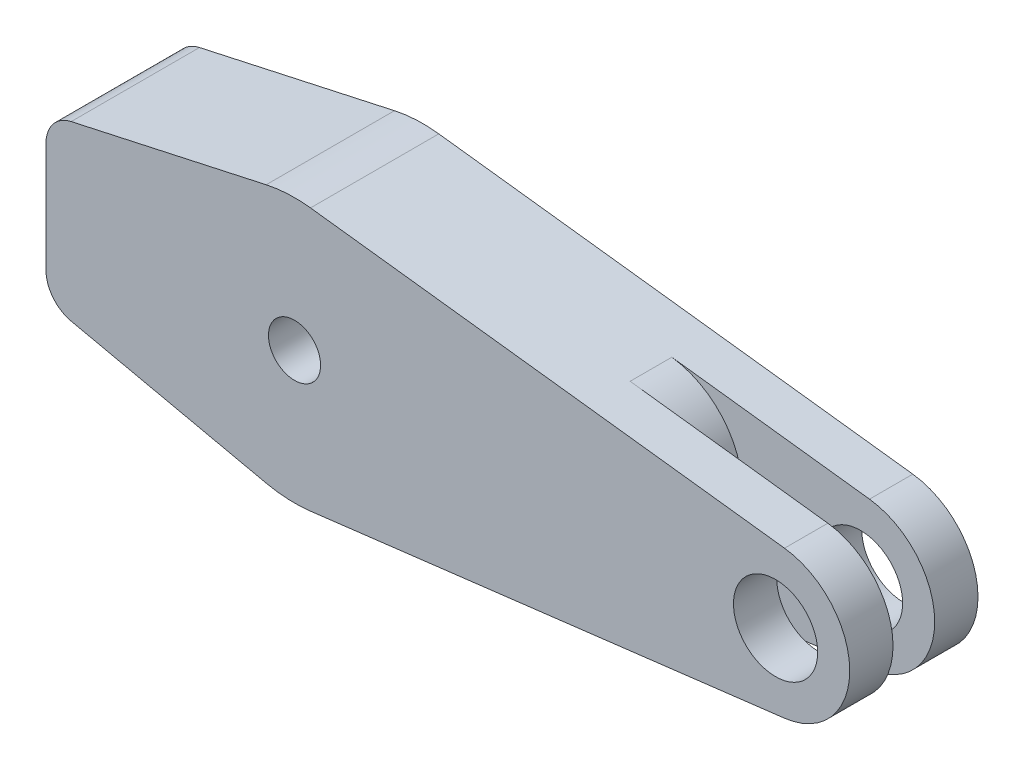
ISO-10303-21;
HEADER;
FILE_DESCRIPTION(('STEP AP214'),'2;1');
FILE_NAME('part.step','',(''),(''),'','','');
FILE_SCHEMA(('AUTOMOTIVE_DESIGN { 1 0 10303 214 1 1 1 1 }'));
ENDSEC;
DATA;
#1=APPLICATION_CONTEXT('core data for automotive mechanical design processes');
#2=APPLICATION_PROTOCOL_DEFINITION('international standard','automotive_design',2000,#1);
#3=PRODUCT_CONTEXT('',#1,'mechanical');
#4=PRODUCT('Part','Part','',(#3));
#5=PRODUCT_RELATED_PRODUCT_CATEGORY('part','',(#4));
#6=PRODUCT_DEFINITION_FORMATION('','',#4);
#7=PRODUCT_DEFINITION_CONTEXT('part definition',#1,'design');
#8=PRODUCT_DEFINITION('design','',#6,#7);
#9=PRODUCT_DEFINITION_SHAPE('','',#8);
#10=(LENGTH_UNIT() NAMED_UNIT(*) SI_UNIT(.MILLI.,.METRE.));
#11=(NAMED_UNIT(*) PLANE_ANGLE_UNIT() SI_UNIT($,.RADIAN.));
#12=(NAMED_UNIT(*) SI_UNIT($,.STERADIAN.) SOLID_ANGLE_UNIT());
#13=UNCERTAINTY_MEASURE_WITH_UNIT(LENGTH_MEASURE(1.E-05),#10,'distance_accuracy_value','');
#14=(GEOMETRIC_REPRESENTATION_CONTEXT(3) GLOBAL_UNCERTAINTY_ASSIGNED_CONTEXT((#13)) GLOBAL_UNIT_ASSIGNED_CONTEXT((#10,
#11,#12)) REPRESENTATION_CONTEXT('',''));
#15=CARTESIAN_POINT('',(0.,0.,0.));
#16=DIRECTION('',(0.,0.,1.));
#17=DIRECTION('',(1.,0.,0.));
#18=AXIS2_PLACEMENT_3D('',#15,#16,#17);
#19=CARTESIAN_POINT('',(-1.76785714285714,-8.05836094515808,8.));
#20=DIRECTION('',(-0.214285714285714,-0.976771023655525,0.));
#21=DIRECTION('',(0.976771023655525,-0.214285714285714,0.));
#22=AXIS2_PLACEMENT_3D('',#19,#20,#21);
#23=PLANE('',#22);
#24=DIRECTION('',(-0.976771023655525,0.214285714285714,0.));
#25=VECTOR('',#24,1.);
#26=CARTESIAN_POINT('',(-1.76785714285714,-8.05836094515808,8.));
#27=LINE('',#26,#25);
#28=CARTESIAN_POINT('',(-1.76785714285714,-8.05836094515808,8.));
#29=VERTEX_POINT('',#28);
#30=CARTESIAN_POINT('',(-13.9285714285714,-5.39052244070856,8.));
#31=VERTEX_POINT('',#30);
#32=EDGE_CURVE('E293',#29,#31,#27,.T.);
#33=ORIENTED_EDGE('',*,*,#32,.T.);
#34=DIRECTION('',(0.,0.,-1.));
#35=VECTOR('',#34,1.);
#36=CARTESIAN_POINT('',(-13.9285714285714,-5.39052244070856,8.));
#37=LINE('',#36,#35);
#38=CARTESIAN_POINT('',(-13.9285714285714,-5.39052244070856,0.));
#39=VERTEX_POINT('',#38);
#40=EDGE_CURVE('E12',#31,#39,#37,.T.);
#41=ORIENTED_EDGE('',*,*,#40,.T.);
#42=DIRECTION('',(-0.976771023655525,0.214285714285714,0.));
#43=VECTOR('',#42,1.);
#44=CARTESIAN_POINT('',(-1.76785714285714,-8.05836094515808,0.));
#45=LINE('',#44,#43);
#46=CARTESIAN_POINT('',(-1.76785714285714,-8.05836094515808,0.));
#47=VERTEX_POINT('',#46);
#48=EDGE_CURVE('E322',#47,#39,#45,.T.);
#49=ORIENTED_EDGE('',*,*,#48,.F.);
#50=DIRECTION('',(0.,0.,-1.));
#51=VECTOR('',#50,1.);
#52=CARTESIAN_POINT('',(-1.76785714285714,-8.05836094515808,8.));
#53=LINE('',#52,#51);
#54=EDGE_CURVE('E367',#29,#47,#53,.T.);
#55=ORIENTED_EDGE('',*,*,#54,.F.);
#56=EDGE_LOOP('',(#33,#41,#49,#55));
#57=FACE_BOUND('',#56,.T.);
#58=ADVANCED_FACE('F72',(#57),#23,.T.);
#59=CARTESIAN_POINT('',(-1.76785714285714,8.05836094515808,8.));
#60=DIRECTION('',(-0.214285714285714,0.976771023655525,0.));
#61=DIRECTION('',(-0.976771023655525,-0.214285714285714,0.));
#62=AXIS2_PLACEMENT_3D('',#59,#60,#61);
#63=PLANE('',#62);
#64=DIRECTION('',(0.976771023655525,0.214285714285714,0.));
#65=VECTOR('',#64,1.);
#66=CARTESIAN_POINT('',(-1.76785714285714,8.05836094515808,0.));
#67=LINE('',#66,#65);
#68=CARTESIAN_POINT('',(-13.9285714285714,5.39052244070856,0.));
#69=VERTEX_POINT('',#68);
#70=CARTESIAN_POINT('',(-1.76785714285714,8.05836094515808,0.));
#71=VERTEX_POINT('',#70);
#72=EDGE_CURVE('E289',#69,#71,#67,.T.);
#73=ORIENTED_EDGE('',*,*,#72,.F.);
#74=DIRECTION('',(0.,0.,1.));
#75=VECTOR('',#74,1.);
#76=CARTESIAN_POINT('',(-13.9285714285714,5.39052244070856,8.));
#77=LINE('',#76,#75);
#78=CARTESIAN_POINT('',(-13.9285714285714,5.39052244070856,8.));
#79=VERTEX_POINT('',#78);
#80=EDGE_CURVE('E413',#69,#79,#77,.T.);
#81=ORIENTED_EDGE('',*,*,#80,.T.);
#82=DIRECTION('',(0.976771023655525,0.214285714285714,0.));
#83=VECTOR('',#82,1.);
#84=CARTESIAN_POINT('',(-1.76785714285714,8.05836094515808,8.));
#85=LINE('',#84,#83);
#86=CARTESIAN_POINT('',(-1.76785714285714,8.05836094515808,8.));
#87=VERTEX_POINT('',#86);
#88=EDGE_CURVE('E290',#79,#87,#85,.T.);
#89=ORIENTED_EDGE('',*,*,#88,.T.);
#90=DIRECTION('',(0.,0.,-1.));
#91=VECTOR('',#90,1.);
#92=CARTESIAN_POINT('',(-1.76785714285714,8.05836094515808,8.));
#93=LINE('',#92,#91);
#94=EDGE_CURVE('E319',#87,#71,#93,.T.);
#95=ORIENTED_EDGE('',*,*,#94,.T.);
#96=EDGE_LOOP('',(#73,#81,#89,#95));
#97=FACE_BOUND('',#96,.T.);
#98=ADVANCED_FACE('F439',(#97),#63,.T.);
#99=CARTESIAN_POINT('',(0.,0.,0.));
#100=DIRECTION('',(0.,0.,1.));
#101=DIRECTION('',(1.,0.,0.));
#102=AXIS2_PLACEMENT_3D('',#99,#100,#101);
#103=PLANE('',#102);
#104=CARTESIAN_POINT('',(30.,0.,0.));
#105=DIRECTION('',(0.,0.,1.));
#106=DIRECTION('',(1.,0.,0.));
#107=AXIS2_PLACEMENT_3D('',#104,#105,#106);
#108=CIRCLE('',#107,2.625);
#109=CARTESIAN_POINT('',(32.625,0.,0.));
#110=VERTEX_POINT('',#109);
#111=EDGE_CURVE('E294',#110,#110,#108,.T.);
#112=ORIENTED_EDGE('',*,*,#111,.T.);
#113=EDGE_LOOP('',(#112));
#114=FACE_BOUND('',#113,.T.);
#115=DIRECTION('',(0.,1.,0.));
#116=VECTOR('',#115,1.);
#117=CARTESIAN_POINT('',(-15.5,11.5023210939197,0.));
#118=LINE('',#117,#116);
#119=CARTESIAN_POINT('',(-15.5,2.99821693892124,0.));
#120=VERTEX_POINT('',#119);
#121=CARTESIAN_POINT('',(-15.5,3.43698039339752,0.));
#122=VERTEX_POINT('',#121);
#123=EDGE_CURVE('E241',#120,#122,#118,.T.);
#124=ORIENTED_EDGE('',*,*,#123,.T.);
#125=CARTESIAN_POINT('',(-13.5,3.43698039339751,0.));
#126=DIRECTION('',(0.,0.,1.));
#127=DIRECTION('',(1.,0.,0.));
#128=AXIS2_PLACEMENT_3D('',#125,#126,#127);
#129=CIRCLE('',#128,2.);
#130=EDGE_CURVE('E81',#122,#69,#129,.F.);
#131=ORIENTED_EDGE('',*,*,#130,.T.);
#132=ORIENTED_EDGE('',*,*,#72,.T.);
#133=CARTESIAN_POINT('',(0.,0.,0.));
#134=DIRECTION('',(0.,0.,1.));
#135=DIRECTION('',(1.,0.,0.));
#136=AXIS2_PLACEMENT_3D('',#133,#134,#135);
#137=CIRCLE('',#136,8.25);
#138=CARTESIAN_POINT('',(0.996875,8.18955067353363,0.));
#139=VERTEX_POINT('',#138);
#140=EDGE_CURVE('E340',#139,#71,#137,.T.);
#141=ORIENTED_EDGE('',*,*,#140,.F.);
#142=DIRECTION('',(0.992672808913166,-0.120833333333333,0.));
#143=VECTOR('',#142,1.);
#144=CARTESIAN_POINT('',(0.996875,8.18955067353363,0.));
#145=LINE('',#144,#143);
#146=CARTESIAN_POINT('',(30.5588541666667,4.5911117412234,0.));
#147=VERTEX_POINT('',#146);
#148=EDGE_CURVE('E336',#139,#147,#145,.T.);
#149=ORIENTED_EDGE('',*,*,#148,.T.);
#150=CARTESIAN_POINT('',(30.,0.,0.));
#151=DIRECTION('',(0.,0.,1.));
#152=DIRECTION('',(1.,0.,0.));
#153=AXIS2_PLACEMENT_3D('',#150,#151,#152);
#154=CIRCLE('',#153,4.62500000000001);
#155=CARTESIAN_POINT('',(30.5588541666667,-4.5911117412234,0.));
#156=VERTEX_POINT('',#155);
#157=EDGE_CURVE('E332',#156,#147,#154,.T.);
#158=ORIENTED_EDGE('',*,*,#157,.F.);
#159=DIRECTION('',(0.992672808913166,0.120833333333333,0.));
#160=VECTOR('',#159,1.);
#161=CARTESIAN_POINT('',(0.996875,-8.18955067353363,0.));
#162=LINE('',#161,#160);
#163=CARTESIAN_POINT('',(0.996875,-8.18955067353363,0.));
#164=VERTEX_POINT('',#163);
#165=EDGE_CURVE('E328',#164,#156,#162,.T.);
#166=ORIENTED_EDGE('',*,*,#165,.F.);
#167=CARTESIAN_POINT('',(0.,0.,0.));
#168=DIRECTION('',(0.,0.,1.));
#169=DIRECTION('',(1.,0.,0.));
#170=AXIS2_PLACEMENT_3D('',#167,#168,#169);
#171=CIRCLE('',#170,8.25);
#172=EDGE_CURVE('E325',#47,#164,#171,.T.);
#173=ORIENTED_EDGE('',*,*,#172,.F.);
#174=ORIENTED_EDGE('',*,*,#48,.T.);
#175=CARTESIAN_POINT('',(-13.5,-3.43698039339752,0.));
#176=DIRECTION('',(0.,0.,1.));
#177=DIRECTION('',(1.,0.,0.));
#178=AXIS2_PLACEMENT_3D('',#175,#176,#177);
#179=CIRCLE('',#178,2.);
#180=CARTESIAN_POINT('',(-15.5,-3.43698039339751,0.));
#181=VERTEX_POINT('',#180);
#182=EDGE_CURVE('E88',#39,#181,#179,.F.);
#183=ORIENTED_EDGE('',*,*,#182,.T.);
#184=CARTESIAN_POINT('',(-15.5,-2.99821693892123,0.));
#185=VERTEX_POINT('',#184);
#186=EDGE_CURVE('E231',#181,#185,#118,.T.);
#187=ORIENTED_EDGE('',*,*,#186,.T.);
#188=DIRECTION('',(-0.976771023655525,0.214285714285714,0.));
#189=VECTOR('',#188,1.);
#190=CARTESIAN_POINT('',(-1.33928571428571,-6.10481889784703,0.));
#191=LINE('',#190,#189);
#192=CARTESIAN_POINT('',(-1.33928571428571,-6.10481889784703,0.));
#193=VERTEX_POINT('',#192);
#194=EDGE_CURVE('E237',#193,#185,#191,.T.);
#195=ORIENTED_EDGE('',*,*,#194,.F.);
#196=CARTESIAN_POINT('',(0.,0.,0.));
#197=DIRECTION('',(0.,0.,1.));
#198=DIRECTION('',(1.,0.,0.));
#199=AXIS2_PLACEMENT_3D('',#196,#197,#198);
#200=CIRCLE('',#199,6.25);
#201=CARTESIAN_POINT('',(1.33928571428571,-6.10481889784703,0.));
#202=VERTEX_POINT('',#201);
#203=EDGE_CURVE('E259',#193,#202,#200,.T.);
#204=ORIENTED_EDGE('',*,*,#203,.T.);
#205=DIRECTION('',(0.976771023655525,0.214285714285714,0.));
#206=VECTOR('',#205,1.);
#207=CARTESIAN_POINT('',(1.33928571428571,-6.10481889784703,0.));
#208=LINE('',#207,#206);
#209=CARTESIAN_POINT('',(18.0357142857143,-2.44192755913881,0.));
#210=VERTEX_POINT('',#209);
#211=EDGE_CURVE('E486',#202,#210,#208,.T.);
#212=ORIENTED_EDGE('',*,*,#211,.T.);
#213=CARTESIAN_POINT('',(17.5,0.,0.));
#214=DIRECTION('',(0.,0.,1.));
#215=DIRECTION('',(1.,0.,0.));
#216=AXIS2_PLACEMENT_3D('',#213,#214,#215);
#217=CIRCLE('',#216,2.5);
#218=CARTESIAN_POINT('',(18.0357142857143,2.44192755913881,0.));
#219=VERTEX_POINT('',#218);
#220=EDGE_CURVE('E510',#219,#210,#217,.F.);
#221=ORIENTED_EDGE('',*,*,#220,.F.);
#222=DIRECTION('',(0.976771023655525,-0.214285714285714,0.));
#223=VECTOR('',#222,1.);
#224=CARTESIAN_POINT('',(1.33928571428571,6.10481889784703,0.));
#225=LINE('',#224,#223);
#226=CARTESIAN_POINT('',(1.33928571428571,6.10481889784703,0.));
#227=VERTEX_POINT('',#226);
#228=EDGE_CURVE('E514',#227,#219,#225,.T.);
#229=ORIENTED_EDGE('',*,*,#228,.F.);
#230=CARTESIAN_POINT('',(-1.33928571428571,6.10481889784703,0.));
#231=VERTEX_POINT('',#230);
#232=EDGE_CURVE('E266',#227,#231,#200,.T.);
#233=ORIENTED_EDGE('',*,*,#232,.T.);
#234=DIRECTION('',(0.976771023655525,0.214285714285714,0.));
#235=VECTOR('',#234,1.);
#236=CARTESIAN_POINT('',(-1.33928571428571,6.10481889784703,0.));
#237=LINE('',#236,#235);
#238=EDGE_CURVE('E260',#120,#231,#237,.T.);
#239=ORIENTED_EDGE('',*,*,#238,.F.);
#240=EDGE_LOOP('',(#124,#131,#132,#141,#149,#158,#166,#173,#174,#183,#187,#195,#204,#212,#221,
#229,#233,#239));
#241=FACE_BOUND('',#240,.T.);
#242=ADVANCED_FACE('F234',(#114,#241),#103,.F.);
#243=CARTESIAN_POINT('',(0.,0.,8.));
#244=DIRECTION('',(0.,0.,1.));
#245=DIRECTION('',(1.,0.,0.));
#246=AXIS2_PLACEMENT_3D('',#243,#244,#245);
#247=PLANE('',#246);
#248=CARTESIAN_POINT('',(0.,0.,8.));
#249=DIRECTION('',(0.,0.,1.));
#250=DIRECTION('',(1.,0.,0.));
#251=AXIS2_PLACEMENT_3D('',#248,#249,#250);
#252=CIRCLE('',#251,1.625);
#253=CARTESIAN_POINT('',(1.625,0.,8.));
#254=VERTEX_POINT('',#253);
#255=EDGE_CURVE('E410',#254,#254,#252,.T.);
#256=ORIENTED_EDGE('',*,*,#255,.F.);
#257=EDGE_LOOP('',(#256));
#258=FACE_BOUND('',#257,.T.);
#259=CARTESIAN_POINT('',(30.,0.,8.));
#260=DIRECTION('',(0.,0.,1.));
#261=DIRECTION('',(1.,0.,0.));
#262=AXIS2_PLACEMENT_3D('',#259,#260,#261);
#263=CIRCLE('',#262,2.625);
#264=CARTESIAN_POINT('',(32.625,0.,8.));
#265=VERTEX_POINT('',#264);
#266=EDGE_CURVE('E315',#265,#265,#263,.T.);
#267=ORIENTED_EDGE('',*,*,#266,.F.);
#268=EDGE_LOOP('',(#267));
#269=FACE_BOUND('',#268,.T.);
#270=ORIENTED_EDGE('',*,*,#88,.F.);
#271=CARTESIAN_POINT('',(-13.5,3.43698039339751,8.));
#272=DIRECTION('',(0.,0.,1.));
#273=DIRECTION('',(1.,0.,0.));
#274=AXIS2_PLACEMENT_3D('',#271,#272,#273);
#275=CIRCLE('',#274,2.);
#276=CARTESIAN_POINT('',(-15.5,3.43698039339752,8.));
#277=VERTEX_POINT('',#276);
#278=EDGE_CURVE('E420',#79,#277,#275,.T.);
#279=ORIENTED_EDGE('',*,*,#278,.T.);
#280=DIRECTION('',(0.,1.,0.));
#281=VECTOR('',#280,1.);
#282=CARTESIAN_POINT('',(-15.5,11.5023210939197,8.));
#283=LINE('',#282,#281);
#284=CARTESIAN_POINT('',(-15.5,-3.43698039339751,8.));
#285=VERTEX_POINT('',#284);
#286=EDGE_CURVE('E240',#285,#277,#283,.T.);
#287=ORIENTED_EDGE('',*,*,#286,.F.);
#288=CARTESIAN_POINT('',(-13.5,-3.43698039339752,8.));
#289=DIRECTION('',(0.,0.,1.));
#290=DIRECTION('',(1.,0.,0.));
#291=AXIS2_PLACEMENT_3D('',#288,#289,#290);
#292=CIRCLE('',#291,2.);
#293=EDGE_CURVE('E417',#285,#31,#292,.T.);
#294=ORIENTED_EDGE('',*,*,#293,.T.);
#295=ORIENTED_EDGE('',*,*,#32,.F.);
#296=CARTESIAN_POINT('',(0.,0.,8.));
#297=DIRECTION('',(0.,0.,1.));
#298=DIRECTION('',(1.,0.,0.));
#299=AXIS2_PLACEMENT_3D('',#296,#297,#298);
#300=CIRCLE('',#299,8.25);
#301=CARTESIAN_POINT('',(0.996875,-8.18955067353363,8.));
#302=VERTEX_POINT('',#301);
#303=EDGE_CURVE('E298',#29,#302,#300,.T.);
#304=ORIENTED_EDGE('',*,*,#303,.T.);
#305=DIRECTION('',(0.992672808913166,0.120833333333333,0.));
#306=VECTOR('',#305,1.);
#307=CARTESIAN_POINT('',(0.996875,-8.18955067353363,8.));
#308=LINE('',#307,#306);
#309=CARTESIAN_POINT('',(30.5588541666667,-4.5911117412234,8.));
#310=VERTEX_POINT('',#309);
#311=EDGE_CURVE('E301',#302,#310,#308,.T.);
#312=ORIENTED_EDGE('',*,*,#311,.T.);
#313=CARTESIAN_POINT('',(30.,0.,8.));
#314=DIRECTION('',(0.,0.,1.));
#315=DIRECTION('',(1.,0.,0.));
#316=AXIS2_PLACEMENT_3D('',#313,#314,#315);
#317=CIRCLE('',#316,4.62500000000001);
#318=CARTESIAN_POINT('',(30.5588541666667,4.5911117412234,8.));
#319=VERTEX_POINT('',#318);
#320=EDGE_CURVE('E304',#310,#319,#317,.T.);
#321=ORIENTED_EDGE('',*,*,#320,.T.);
#322=DIRECTION('',(0.992672808913166,-0.120833333333333,0.));
#323=VECTOR('',#322,1.);
#324=CARTESIAN_POINT('',(0.996875,8.18955067353363,8.));
#325=LINE('',#324,#323);
#326=CARTESIAN_POINT('',(0.996875,8.18955067353363,8.));
#327=VERTEX_POINT('',#326);
#328=EDGE_CURVE('E307',#327,#319,#325,.T.);
#329=ORIENTED_EDGE('',*,*,#328,.F.);
#330=CARTESIAN_POINT('',(0.,0.,8.));
#331=DIRECTION('',(0.,0.,1.));
#332=DIRECTION('',(1.,0.,0.));
#333=AXIS2_PLACEMENT_3D('',#330,#331,#332);
#334=CIRCLE('',#333,8.25);
#335=EDGE_CURVE('E311',#327,#87,#334,.T.);
#336=ORIENTED_EDGE('',*,*,#335,.T.);
#337=EDGE_LOOP('',(#270,#279,#287,#294,#295,#304,#312,#321,#329,#336));
#338=FACE_BOUND('',#337,.T.);
#339=ADVANCED_FACE('F445',(#258,#269,#338),#247,.T.);
#340=CARTESIAN_POINT('',(-1.33928571428571,6.10481889784703,3.15));
#341=DIRECTION('',(-0.214285714285714,0.976771023655524,0.));
#342=DIRECTION('',(-0.976771023655525,-0.214285714285714,0.));
#343=AXIS2_PLACEMENT_3D('',#340,#341,#342);
#344=PLANE('',#343);
#345=DIRECTION('',(0.,0.,1.));
#346=VECTOR('',#345,1.);
#347=CARTESIAN_POINT('',(-15.5,2.99821693892123,3.15));
#348=LINE('',#347,#346);
#349=CARTESIAN_POINT('',(-15.5,2.99821693892123,3.15));
#350=VERTEX_POINT('',#349);
#351=EDGE_CURVE('E253',#120,#350,#348,.T.);
#352=ORIENTED_EDGE('',*,*,#351,.F.);
#353=ORIENTED_EDGE('',*,*,#238,.T.);
#354=DIRECTION('',(0.,0.,-1.));
#355=VECTOR('',#354,1.);
#356=CARTESIAN_POINT('',(-1.33928571428571,6.10481889784703,3.15));
#357=LINE('',#356,#355);
#358=CARTESIAN_POINT('',(-1.33928571428571,6.10481889784703,3.15));
#359=VERTEX_POINT('',#358);
#360=EDGE_CURVE('E276',#359,#231,#357,.T.);
#361=ORIENTED_EDGE('',*,*,#360,.F.);
#362=DIRECTION('',(0.976771023655525,0.214285714285714,0.));
#363=VECTOR('',#362,1.);
#364=CARTESIAN_POINT('',(-1.33928571428571,6.10481889784703,3.15));
#365=LINE('',#364,#363);
#366=EDGE_CURVE('E501',#350,#359,#365,.T.);
#367=ORIENTED_EDGE('',*,*,#366,.F.);
#368=EDGE_LOOP('',(#352,#353,#361,#367));
#369=FACE_BOUND('',#368,.T.);
#370=ADVANCED_FACE('F529',(#369),#344,.F.);
#371=CARTESIAN_POINT('',(-1.33928571428571,-6.10481889784703,3.15));
#372=DIRECTION('',(-0.214285714285714,-0.976771023655524,0.));
#373=DIRECTION('',(0.976771023655525,-0.214285714285714,0.));
#374=AXIS2_PLACEMENT_3D('',#371,#372,#373);
#375=PLANE('',#374);
#376=DIRECTION('',(0.,0.,-1.));
#377=VECTOR('',#376,1.);
#378=CARTESIAN_POINT('',(-15.5,-2.99821693892124,3.15));
#379=LINE('',#378,#377);
#380=CARTESIAN_POINT('',(-15.5,-2.99821693892124,3.15));
#381=VERTEX_POINT('',#380);
#382=EDGE_CURVE('E244',#381,#185,#379,.T.);
#383=ORIENTED_EDGE('',*,*,#382,.F.);
#384=DIRECTION('',(-0.976771023655525,0.214285714285714,0.));
#385=VECTOR('',#384,1.);
#386=CARTESIAN_POINT('',(-1.33928571428571,-6.10481889784703,3.15));
#387=LINE('',#386,#385);
#388=CARTESIAN_POINT('',(-1.33928571428571,-6.10481889784703,3.15));
#389=VERTEX_POINT('',#388);
#390=EDGE_CURVE('E504',#389,#381,#387,.T.);
#391=ORIENTED_EDGE('',*,*,#390,.F.);
#392=DIRECTION('',(0.,0.,-1.));
#393=VECTOR('',#392,1.);
#394=CARTESIAN_POINT('',(-1.33928571428571,-6.10481889784703,3.15));
#395=LINE('',#394,#393);
#396=EDGE_CURVE('E256',#389,#193,#395,.T.);
#397=ORIENTED_EDGE('',*,*,#396,.T.);
#398=ORIENTED_EDGE('',*,*,#194,.T.);
#399=EDGE_LOOP('',(#383,#391,#397,#398));
#400=FACE_BOUND('',#399,.T.);
#401=ADVANCED_FACE('F255',(#400),#375,.F.);
#402=CARTESIAN_POINT('',(0.,0.,3.15));
#403=DIRECTION('',(0.,0.,1.));
#404=DIRECTION('',(1.,0.,0.));
#405=AXIS2_PLACEMENT_3D('',#402,#403,#404);
#406=PLANE('',#405);
#407=CARTESIAN_POINT('',(0.,0.,3.15));
#408=DIRECTION('',(0.,0.,1.));
#409=DIRECTION('',(1.,0.,0.));
#410=AXIS2_PLACEMENT_3D('',#407,#408,#409);
#411=CIRCLE('',#410,1.625);
#412=CARTESIAN_POINT('',(1.625,0.,3.15));
#413=VERTEX_POINT('',#412);
#414=EDGE_CURVE('E405',#413,#413,#411,.F.);
#415=ORIENTED_EDGE('',*,*,#414,.F.);
#416=EDGE_LOOP('',(#415));
#417=FACE_BOUND('',#416,.T.);
#418=DIRECTION('',(0.,-1.,0.));
#419=VECTOR('',#418,1.);
#420=CARTESIAN_POINT('',(-15.5,0.,3.15));
#421=LINE('',#420,#419);
#422=EDGE_CURVE('E248',#350,#381,#421,.T.);
#423=ORIENTED_EDGE('',*,*,#422,.F.);
#424=ORIENTED_EDGE('',*,*,#366,.T.);
#425=CARTESIAN_POINT('',(0.,0.,3.15));
#426=DIRECTION('',(0.,0.,1.));
#427=DIRECTION('',(1.,0.,0.));
#428=AXIS2_PLACEMENT_3D('',#425,#426,#427);
#429=CIRCLE('',#428,6.25);
#430=CARTESIAN_POINT('',(1.33928571428571,6.10481889784703,3.15));
#431=VERTEX_POINT('',#430);
#432=EDGE_CURVE('E497',#431,#359,#429,.T.);
#433=ORIENTED_EDGE('',*,*,#432,.F.);
#434=DIRECTION('',(0.976771023655525,-0.214285714285714,0.));
#435=VECTOR('',#434,1.);
#436=CARTESIAN_POINT('',(1.33928571428571,6.10481889784703,3.15));
#437=LINE('',#436,#435);
#438=CARTESIAN_POINT('',(18.0357142857143,2.44192755913881,3.15));
#439=VERTEX_POINT('',#438);
#440=EDGE_CURVE('E493',#431,#439,#437,.T.);
#441=ORIENTED_EDGE('',*,*,#440,.T.);
#442=CARTESIAN_POINT('',(17.5,0.,3.15));
#443=DIRECTION('',(0.,0.,1.));
#444=DIRECTION('',(1.,0.,0.));
#445=AXIS2_PLACEMENT_3D('',#442,#443,#444);
#446=CIRCLE('',#445,2.5);
#447=CARTESIAN_POINT('',(18.0357142857143,-2.44192755913881,3.15));
#448=VERTEX_POINT('',#447);
#449=EDGE_CURVE('E489',#439,#448,#446,.F.);
#450=ORIENTED_EDGE('',*,*,#449,.T.);
#451=DIRECTION('',(0.976771023655525,0.214285714285714,0.));
#452=VECTOR('',#451,1.);
#453=CARTESIAN_POINT('',(1.33928571428571,-6.10481889784703,3.15));
#454=LINE('',#453,#452);
#455=CARTESIAN_POINT('',(1.33928571428571,-6.10481889784703,3.15));
#456=VERTEX_POINT('',#455);
#457=EDGE_CURVE('E264',#456,#448,#454,.T.);
#458=ORIENTED_EDGE('',*,*,#457,.F.);
#459=EDGE_CURVE('E273',#389,#456,#429,.T.);
#460=ORIENTED_EDGE('',*,*,#459,.F.);
#461=ORIENTED_EDGE('',*,*,#390,.T.);
#462=EDGE_LOOP('',(#423,#424,#433,#441,#450,#458,#460,#461));
#463=FACE_BOUND('',#462,.T.);
#464=ADVANCED_FACE('F531',(#417,#463),#406,.F.);
#465=CARTESIAN_POINT('',(30.,0.,8.));
#466=DIRECTION('',(0.,0.,-1.));
#467=DIRECTION('',(-1.,0.,0.));
#468=AXIS2_PLACEMENT_3D('',#465,#466,#467);
#469=CYLINDRICAL_SURFACE('',#468,2.625);
#470=CARTESIAN_POINT('',(30.,0.,2.7));
#471=DIRECTION('',(0.,0.,-1.));
#472=DIRECTION('',(-1.,0.,0.));
#473=AXIS2_PLACEMENT_3D('',#470,#471,#472);
#474=CIRCLE('',#473,2.625);
#475=CARTESIAN_POINT('',(27.375,0.,2.7));
#476=VERTEX_POINT('',#475);
#477=EDGE_CURVE('E482',#476,#476,#474,.T.);
#478=ORIENTED_EDGE('',*,*,#477,.F.);
#479=EDGE_LOOP('',(#478));
#480=FACE_BOUND('',#479,.T.);
#481=ORIENTED_EDGE('',*,*,#111,.F.);
#482=EDGE_LOOP('',(#481));
#483=FACE_BOUND('',#482,.T.);
#484=ADVANCED_FACE('F625',(#480,#483),#469,.F.);
#485=CARTESIAN_POINT('',(30.,0.,8.));
#486=DIRECTION('',(0.,0.,-1.));
#487=DIRECTION('',(-1.,0.,0.));
#488=AXIS2_PLACEMENT_3D('',#485,#486,#487);
#489=CYLINDRICAL_SURFACE('',#488,4.62500000000001);
#490=DIRECTION('',(0.,0.,-1.));
#491=VECTOR('',#490,1.);
#492=CARTESIAN_POINT('',(30.5588541666667,4.5911117412234,8.));
#493=LINE('',#492,#491);
#494=CARTESIAN_POINT('',(30.5588541666667,4.5911117412234,2.7));
#495=VERTEX_POINT('',#494);
#496=EDGE_CURVE('E353',#495,#147,#493,.T.);
#497=ORIENTED_EDGE('',*,*,#496,.F.);
#498=CARTESIAN_POINT('',(30.,0.,2.7));
#499=DIRECTION('',(0.,0.,-1.));
#500=DIRECTION('',(-1.,0.,0.));
#501=AXIS2_PLACEMENT_3D('',#498,#499,#500);
#502=CIRCLE('',#501,4.62500000000001);
#503=CARTESIAN_POINT('',(30.5588541666667,-4.5911117412234,2.7));
#504=VERTEX_POINT('',#503);
#505=EDGE_CURVE('E475',#495,#504,#502,.T.);
#506=ORIENTED_EDGE('',*,*,#505,.T.);
#507=DIRECTION('',(0.,0.,-1.));
#508=VECTOR('',#507,1.);
#509=CARTESIAN_POINT('',(30.5588541666667,-4.5911117412234,8.));
#510=LINE('',#509,#508);
#511=EDGE_CURVE('E358',#504,#156,#510,.T.);
#512=ORIENTED_EDGE('',*,*,#511,.T.);
#513=ORIENTED_EDGE('',*,*,#157,.T.);
#514=EDGE_LOOP('',(#497,#506,#512,#513));
#515=FACE_BOUND('',#514,.T.);
#516=ADVANCED_FACE('F542',(#515),#489,.T.);
#517=CARTESIAN_POINT('',(30.,0.,5.3));
#518=DIRECTION('',(0.,0.,1.));
#519=DIRECTION('',(1.,0.,0.));
#520=AXIS2_PLACEMENT_3D('',#517,#518,#519);
#521=CIRCLE('',#520,2.625);
#522=CARTESIAN_POINT('',(32.625,0.,5.3));
#523=VERTEX_POINT('',#522);
#524=EDGE_CURVE('E471',#523,#523,#521,.T.);
#525=ORIENTED_EDGE('',*,*,#524,.F.);
#526=EDGE_LOOP('',(#525));
#527=FACE_BOUND('',#526,.T.);
#528=ORIENTED_EDGE('',*,*,#266,.T.);
#529=EDGE_LOOP('',(#528));
#530=FACE_BOUND('',#529,.T.);
#531=ADVANCED_FACE('F652',(#527,#530),#469,.F.);
#532=CARTESIAN_POINT('',(0.,0.,8.));
#533=DIRECTION('',(0.,0.,-1.));
#534=DIRECTION('',(-1.,0.,0.));
#535=AXIS2_PLACEMENT_3D('',#532,#533,#534);
#536=CYLINDRICAL_SURFACE('',#535,8.25);
#537=ORIENTED_EDGE('',*,*,#172,.T.);
#538=DIRECTION('',(0.,0.,-1.));
#539=VECTOR('',#538,1.);
#540=CARTESIAN_POINT('',(0.996875,-8.18955067353363,8.));
#541=LINE('',#540,#539);
#542=EDGE_CURVE('E363',#302,#164,#541,.T.);
#543=ORIENTED_EDGE('',*,*,#542,.F.);
#544=ORIENTED_EDGE('',*,*,#303,.F.);
#545=ORIENTED_EDGE('',*,*,#54,.T.);
#546=EDGE_LOOP('',(#537,#543,#544,#545));
#547=FACE_BOUND('',#546,.T.);
#548=ADVANCED_FACE('F583',(#547),#536,.T.);
#549=CARTESIAN_POINT('',(0.996875,-8.18955067353363,8.));
#550=DIRECTION('',(-0.120833333333333,0.992672808913166,0.));
#551=DIRECTION('',(-0.992672808913166,-0.120833333333333,0.));
#552=AXIS2_PLACEMENT_3D('',#549,#550,#551);
#553=PLANE('',#552);
#554=DIRECTION('',(0.,0.,1.));
#555=VECTOR('',#554,1.);
#556=CARTESIAN_POINT('',(18.2291666666667,-6.09194587932625,8.));
#557=LINE('',#556,#555);
#558=CARTESIAN_POINT('',(18.2291666666667,-6.09194587932625,2.7));
#559=VERTEX_POINT('',#558);
#560=CARTESIAN_POINT('',(18.2291666666667,-6.09194587932625,5.3));
#561=VERTEX_POINT('',#560);
#562=EDGE_CURVE('E376',#559,#561,#557,.T.);
#563=ORIENTED_EDGE('',*,*,#562,.T.);
#564=DIRECTION('',(0.992672808913166,0.120833333333333,0.));
#565=VECTOR('',#564,1.);
#566=CARTESIAN_POINT('',(0.996874999999999,-8.18955067353363,5.30000000000001));
#567=LINE('',#566,#565);
#568=CARTESIAN_POINT('',(30.5588541666667,-4.5911117412234,5.3));
#569=VERTEX_POINT('',#568);
#570=EDGE_CURVE('E467',#561,#569,#567,.T.);
#571=ORIENTED_EDGE('',*,*,#570,.T.);
#572=EDGE_CURVE('E359',#310,#569,#510,.T.);
#573=ORIENTED_EDGE('',*,*,#572,.F.);
#574=ORIENTED_EDGE('',*,*,#311,.F.);
#575=ORIENTED_EDGE('',*,*,#542,.T.);
#576=ORIENTED_EDGE('',*,*,#165,.T.);
#577=ORIENTED_EDGE('',*,*,#511,.F.);
#578=DIRECTION('',(-0.992672808913166,-0.120833333333333,0.));
#579=VECTOR('',#578,1.);
#580=CARTESIAN_POINT('',(0.996874999999998,-8.18955067353363,2.70000000000001));
#581=LINE('',#580,#579);
#582=EDGE_CURVE('E479',#504,#559,#581,.T.);
#583=ORIENTED_EDGE('',*,*,#582,.T.);
#584=EDGE_LOOP('',(#563,#571,#573,#574,#575,#576,#577,#583));
#585=FACE_BOUND('',#584,.T.);
#586=ADVANCED_FACE('F546',(#585),#553,.F.);
#587=ORIENTED_EDGE('',*,*,#572,.T.);
#588=CARTESIAN_POINT('',(30.,0.,5.3));
#589=DIRECTION('',(0.,0.,1.));
#590=DIRECTION('',(1.,0.,0.));
#591=AXIS2_PLACEMENT_3D('',#588,#589,#590);
#592=CIRCLE('',#591,4.62500000000001);
#593=CARTESIAN_POINT('',(30.5588541666667,4.5911117412234,5.3));
#594=VERTEX_POINT('',#593);
#595=EDGE_CURVE('E460',#569,#594,#592,.T.);
#596=ORIENTED_EDGE('',*,*,#595,.T.);
#597=EDGE_CURVE('E354',#319,#594,#493,.T.);
#598=ORIENTED_EDGE('',*,*,#597,.F.);
#599=ORIENTED_EDGE('',*,*,#320,.F.);
#600=EDGE_LOOP('',(#587,#596,#598,#599));
#601=FACE_BOUND('',#600,.T.);
#602=ADVANCED_FACE('F577',(#601),#489,.T.);
#603=CARTESIAN_POINT('',(0.996875,8.18955067353363,8.));
#604=DIRECTION('',(0.120833333333333,0.992672808913166,0.));
#605=DIRECTION('',(-0.992672808913166,0.120833333333333,0.));
#606=AXIS2_PLACEMENT_3D('',#603,#604,#605);
#607=PLANE('',#606);
#608=DIRECTION('',(0.992672808913166,-0.120833333333333,0.));
#609=VECTOR('',#608,1.);
#610=CARTESIAN_POINT('',(0.996874999999999,8.18955067353363,5.30000000000001));
#611=LINE('',#610,#609);
#612=CARTESIAN_POINT('',(18.2291666666667,6.09194587932625,5.3));
#613=VERTEX_POINT('',#612);
#614=EDGE_CURVE('E370',#613,#594,#611,.T.);
#615=ORIENTED_EDGE('',*,*,#614,.F.);
#616=DIRECTION('',(0.,0.,1.));
#617=VECTOR('',#616,1.);
#618=CARTESIAN_POINT('',(18.2291666666667,6.09194587932625,2.7));
#619=LINE('',#618,#617);
#620=CARTESIAN_POINT('',(18.2291666666667,6.09194587932625,2.7));
#621=VERTEX_POINT('',#620);
#622=EDGE_CURVE('E387',#613,#621,#619,.F.);
#623=ORIENTED_EDGE('',*,*,#622,.T.);
#624=DIRECTION('',(-0.992672808913166,0.120833333333333,0.));
#625=VECTOR('',#624,1.);
#626=CARTESIAN_POINT('',(0.996874999999998,8.18955067353363,2.70000000000001));
#627=LINE('',#626,#625);
#628=EDGE_CURVE('E373',#495,#621,#627,.T.);
#629=ORIENTED_EDGE('',*,*,#628,.F.);
#630=ORIENTED_EDGE('',*,*,#496,.T.);
#631=ORIENTED_EDGE('',*,*,#148,.F.);
#632=DIRECTION('',(0.,0.,-1.));
#633=VECTOR('',#632,1.);
#634=CARTESIAN_POINT('',(0.996875,8.18955067353363,8.));
#635=LINE('',#634,#633);
#636=EDGE_CURVE('E350',#327,#139,#635,.T.);
#637=ORIENTED_EDGE('',*,*,#636,.F.);
#638=ORIENTED_EDGE('',*,*,#328,.T.);
#639=ORIENTED_EDGE('',*,*,#597,.T.);
#640=EDGE_LOOP('',(#615,#623,#629,#630,#631,#637,#638,#639));
#641=FACE_BOUND('',#640,.T.);
#642=ADVANCED_FACE('F552',(#641),#607,.T.);
#643=CARTESIAN_POINT('',(0.,0.,8.));
#644=DIRECTION('',(0.,0.,-1.));
#645=DIRECTION('',(-1.,0.,0.));
#646=AXIS2_PLACEMENT_3D('',#643,#644,#645);
#647=CYLINDRICAL_SURFACE('',#646,8.25);
#648=ORIENTED_EDGE('',*,*,#140,.T.);
#649=ORIENTED_EDGE('',*,*,#94,.F.);
#650=ORIENTED_EDGE('',*,*,#335,.F.);
#651=ORIENTED_EDGE('',*,*,#636,.T.);
#652=EDGE_LOOP('',(#648,#649,#650,#651));
#653=FACE_BOUND('',#652,.T.);
#654=ADVANCED_FACE('F644',(#653),#647,.T.);
#655=CARTESIAN_POINT('',(1.33928571428571,-6.10481889784703,3.15));
#656=DIRECTION('',(-0.214285714285714,0.976771023655524,0.));
#657=DIRECTION('',(-0.976771023655525,-0.214285714285714,0.));
#658=AXIS2_PLACEMENT_3D('',#655,#656,#657);
#659=PLANE('',#658);
#660=ORIENTED_EDGE('',*,*,#211,.F.);
#661=DIRECTION('',(0.,0.,-1.));
#662=VECTOR('',#661,1.);
#663=CARTESIAN_POINT('',(1.33928571428571,-6.10481889784703,3.15));
#664=LINE('',#663,#662);
#665=EDGE_CURVE('E269',#456,#202,#664,.T.);
#666=ORIENTED_EDGE('',*,*,#665,.F.);
#667=ORIENTED_EDGE('',*,*,#457,.T.);
#668=DIRECTION('',(0.,0.,-1.));
#669=VECTOR('',#668,1.);
#670=CARTESIAN_POINT('',(18.0357142857143,-2.44192755913881,3.15));
#671=LINE('',#670,#669);
#672=EDGE_CURVE('E286',#448,#210,#671,.T.);
#673=ORIENTED_EDGE('',*,*,#672,.T.);
#674=EDGE_LOOP('',(#660,#666,#667,#673));
#675=FACE_BOUND('',#674,.T.);
#676=ADVANCED_FACE('F640',(#675),#659,.T.);
#677=CARTESIAN_POINT('',(17.5,0.,3.15));
#678=DIRECTION('',(0.,0.,-1.));
#679=DIRECTION('',(-1.,0.,0.));
#680=AXIS2_PLACEMENT_3D('',#677,#678,#679);
#681=CYLINDRICAL_SURFACE('',#680,2.5);
#682=ORIENTED_EDGE('',*,*,#220,.T.);
#683=ORIENTED_EDGE('',*,*,#672,.F.);
#684=ORIENTED_EDGE('',*,*,#449,.F.);
#685=DIRECTION('',(0.,0.,-1.));
#686=VECTOR('',#685,1.);
#687=CARTESIAN_POINT('',(18.0357142857143,2.44192755913881,3.15));
#688=LINE('',#687,#686);
#689=EDGE_CURVE('E283',#439,#219,#688,.T.);
#690=ORIENTED_EDGE('',*,*,#689,.T.);
#691=EDGE_LOOP('',(#682,#683,#684,#690));
#692=FACE_BOUND('',#691,.T.);
#693=ADVANCED_FACE('F636',(#692),#681,.F.);
#694=CARTESIAN_POINT('',(1.33928571428571,6.10481889784703,3.15));
#695=DIRECTION('',(0.214285714285714,0.976771023655524,0.));
#696=DIRECTION('',(-0.976771023655525,0.214285714285714,0.));
#697=AXIS2_PLACEMENT_3D('',#694,#695,#696);
#698=PLANE('',#697);
#699=ORIENTED_EDGE('',*,*,#228,.T.);
#700=ORIENTED_EDGE('',*,*,#689,.F.);
#701=ORIENTED_EDGE('',*,*,#440,.F.);
#702=DIRECTION('',(0.,0.,-1.));
#703=VECTOR('',#702,1.);
#704=CARTESIAN_POINT('',(1.33928571428571,6.10481889784703,3.15));
#705=LINE('',#704,#703);
#706=EDGE_CURVE('E280',#431,#227,#705,.T.);
#707=ORIENTED_EDGE('',*,*,#706,.T.);
#708=EDGE_LOOP('',(#699,#700,#701,#707));
#709=FACE_BOUND('',#708,.T.);
#710=ADVANCED_FACE('F633',(#709),#698,.F.);
#711=CARTESIAN_POINT('',(0.,0.,3.15));
#712=DIRECTION('',(0.,0.,-1.));
#713=DIRECTION('',(-1.,0.,0.));
#714=AXIS2_PLACEMENT_3D('',#711,#712,#713);
#715=CYLINDRICAL_SURFACE('',#714,6.25);
#716=ORIENTED_EDGE('',*,*,#232,.F.);
#717=ORIENTED_EDGE('',*,*,#706,.F.);
#718=ORIENTED_EDGE('',*,*,#432,.T.);
#719=ORIENTED_EDGE('',*,*,#360,.T.);
#720=EDGE_LOOP('',(#716,#717,#718,#719));
#721=FACE_BOUND('',#720,.T.);
#722=ADVANCED_FACE('F523',(#721),#715,.F.);
#723=ORIENTED_EDGE('',*,*,#203,.F.);
#724=ORIENTED_EDGE('',*,*,#396,.F.);
#725=ORIENTED_EDGE('',*,*,#459,.T.);
#726=ORIENTED_EDGE('',*,*,#665,.T.);
#727=EDGE_LOOP('',(#723,#724,#725,#726));
#728=FACE_BOUND('',#727,.T.);
#729=ADVANCED_FACE('F622',(#728),#715,.F.);
#730=CARTESIAN_POINT('',(22.625,-8.25,2.7));
#731=DIRECTION('',(-1.,0.,0.));
#732=DIRECTION('',(0.,0.,1.));
#733=AXIS2_PLACEMENT_3D('',#730,#731,#732);
#734=PLANE('',#733);
#735=DIRECTION('',(0.,1.,0.));
#736=VECTOR('',#735,1.);
#737=CARTESIAN_POINT('',(22.625,-8.25,5.3));
#738=LINE('',#737,#736);
#739=CARTESIAN_POINT('',(22.625,-1.12858183476042,5.3));
#740=VERTEX_POINT('',#739);
#741=CARTESIAN_POINT('',(22.625,1.12858183476042,5.3));
#742=VERTEX_POINT('',#741);
#743=EDGE_CURVE('E409',#740,#742,#738,.T.);
#744=ORIENTED_EDGE('',*,*,#743,.F.);
#745=DIRECTION('',(0.,0.,1.));
#746=VECTOR('',#745,1.);
#747=CARTESIAN_POINT('',(22.625,-1.12858183476042,2.7));
#748=LINE('',#747,#746);
#749=CARTESIAN_POINT('',(22.625,-1.12858183476042,2.7));
#750=VERTEX_POINT('',#749);
#751=EDGE_CURVE('E384',#740,#750,#748,.F.);
#752=ORIENTED_EDGE('',*,*,#751,.T.);
#753=DIRECTION('',(0.,1.,0.));
#754=VECTOR('',#753,1.);
#755=CARTESIAN_POINT('',(22.625,-8.25,2.7));
#756=LINE('',#755,#754);
#757=CARTESIAN_POINT('',(22.625,1.12858183476042,2.7));
#758=VERTEX_POINT('',#757);
#759=EDGE_CURVE('E456',#750,#758,#756,.T.);
#760=ORIENTED_EDGE('',*,*,#759,.T.);
#761=DIRECTION('',(0.,0.,1.));
#762=VECTOR('',#761,1.);
#763=CARTESIAN_POINT('',(22.625,1.12858183476042,5.3));
#764=LINE('',#763,#762);
#765=EDGE_CURVE('E380',#758,#742,#764,.T.);
#766=ORIENTED_EDGE('',*,*,#765,.T.);
#767=EDGE_LOOP('',(#744,#752,#760,#766));
#768=FACE_BOUND('',#767,.T.);
#769=ADVANCED_FACE('F571',(#768),#734,.F.);
#770=CARTESIAN_POINT('',(46.625,-8.25,2.7));
#771=DIRECTION('',(0.,0.,-1.));
#772=DIRECTION('',(-1.,0.,0.));
#773=AXIS2_PLACEMENT_3D('',#770,#771,#772);
#774=PLANE('',#773);
#775=ORIENTED_EDGE('',*,*,#477,.T.);
#776=EDGE_LOOP('',(#775));
#777=FACE_BOUND('',#776,.T.);
#778=ORIENTED_EDGE('',*,*,#505,.F.);
#779=ORIENTED_EDGE('',*,*,#628,.T.);
#780=CARTESIAN_POINT('',(17.625,1.12858183476042,2.70000000000001));
#781=DIRECTION('',(0.,0.,-1.));
#782=DIRECTION('',(-1.,0.,0.));
#783=AXIS2_PLACEMENT_3D('',#780,#781,#782);
#784=CIRCLE('',#783,5.);
#785=EDGE_CURVE('E402',#621,#758,#784,.T.);
#786=ORIENTED_EDGE('',*,*,#785,.T.);
#787=ORIENTED_EDGE('',*,*,#759,.F.);
#788=CARTESIAN_POINT('',(17.625,-1.12858183476042,2.7));
#789=DIRECTION('',(0.,0.,-1.));
#790=DIRECTION('',(-1.,0.,0.));
#791=AXIS2_PLACEMENT_3D('',#788,#789,#790);
#792=CIRCLE('',#791,5.);
#793=EDGE_CURVE('E394',#750,#559,#792,.T.);
#794=ORIENTED_EDGE('',*,*,#793,.T.);
#795=ORIENTED_EDGE('',*,*,#582,.F.);
#796=EDGE_LOOP('',(#778,#779,#786,#787,#794,#795));
#797=FACE_BOUND('',#796,.T.);
#798=ADVANCED_FACE('F558',(#777,#797),#774,.F.);
#799=CARTESIAN_POINT('',(46.625,-8.25,5.3));
#800=DIRECTION('',(0.,0.,1.));
#801=DIRECTION('',(1.,0.,0.));
#802=AXIS2_PLACEMENT_3D('',#799,#800,#801);
#803=PLANE('',#802);
#804=ORIENTED_EDGE('',*,*,#524,.T.);
#805=EDGE_LOOP('',(#804));
#806=FACE_BOUND('',#805,.T.);
#807=ORIENTED_EDGE('',*,*,#570,.F.);
#808=CARTESIAN_POINT('',(17.625,-1.12858183476042,5.3));
#809=DIRECTION('',(0.,0.,1.));
#810=DIRECTION('',(1.,0.,0.));
#811=AXIS2_PLACEMENT_3D('',#808,#809,#810);
#812=CIRCLE('',#811,5.);
#813=EDGE_CURVE('E391',#561,#740,#812,.T.);
#814=ORIENTED_EDGE('',*,*,#813,.T.);
#815=ORIENTED_EDGE('',*,*,#743,.T.);
#816=CARTESIAN_POINT('',(17.625,1.12858183476042,5.3));
#817=DIRECTION('',(0.,0.,1.));
#818=DIRECTION('',(1.,0.,0.));
#819=AXIS2_PLACEMENT_3D('',#816,#817,#818);
#820=CIRCLE('',#819,5.);
#821=EDGE_CURVE('E398',#742,#613,#820,.T.);
#822=ORIENTED_EDGE('',*,*,#821,.T.);
#823=ORIENTED_EDGE('',*,*,#614,.T.);
#824=ORIENTED_EDGE('',*,*,#595,.F.);
#825=EDGE_LOOP('',(#807,#814,#815,#822,#823,#824));
#826=FACE_BOUND('',#825,.T.);
#827=ADVANCED_FACE('F569',(#806,#826),#803,.F.);
#828=CARTESIAN_POINT('',(17.625,-1.12858183476042,8.));
#829=DIRECTION('',(0.,0.,1.));
#830=DIRECTION('',(1.,0.,0.));
#831=AXIS2_PLACEMENT_3D('',#828,#829,#830);
#832=CYLINDRICAL_SURFACE('',#831,5.);
#833=ORIENTED_EDGE('',*,*,#793,.F.);
#834=ORIENTED_EDGE('',*,*,#751,.F.);
#835=ORIENTED_EDGE('',*,*,#813,.F.);
#836=ORIENTED_EDGE('',*,*,#562,.F.);
#837=EDGE_LOOP('',(#833,#834,#835,#836));
#838=FACE_BOUND('',#837,.T.);
#839=ADVANCED_FACE('F565',(#838),#832,.T.);
#840=CARTESIAN_POINT('',(17.625,1.12858183476042,2.7));
#841=DIRECTION('',(0.,0.,-1.));
#842=DIRECTION('',(-1.,0.,0.));
#843=AXIS2_PLACEMENT_3D('',#840,#841,#842);
#844=CYLINDRICAL_SURFACE('',#843,5.);
#845=ORIENTED_EDGE('',*,*,#785,.F.);
#846=ORIENTED_EDGE('',*,*,#622,.F.);
#847=ORIENTED_EDGE('',*,*,#821,.F.);
#848=ORIENTED_EDGE('',*,*,#765,.F.);
#849=EDGE_LOOP('',(#845,#846,#847,#848));
#850=FACE_BOUND('',#849,.T.);
#851=ADVANCED_FACE('F574',(#850),#844,.T.);
#852=CARTESIAN_POINT('',(0.,0.,8.));
#853=DIRECTION('',(0.,0.,-1.));
#854=DIRECTION('',(-1.,0.,0.));
#855=AXIS2_PLACEMENT_3D('',#852,#853,#854);
#856=CYLINDRICAL_SURFACE('',#855,1.625);
#857=ORIENTED_EDGE('',*,*,#255,.T.);
#858=EDGE_LOOP('',(#857));
#859=FACE_BOUND('',#858,.T.);
#860=ORIENTED_EDGE('',*,*,#414,.T.);
#861=EDGE_LOOP('',(#860));
#862=FACE_BOUND('',#861,.T.);
#863=ADVANCED_FACE('F602',(#859,#862),#856,.F.);
#864=CARTESIAN_POINT('',(-15.5,11.5023210939197,8.));
#865=DIRECTION('',(-1.,0.,0.));
#866=DIRECTION('',(0.,-1.,0.));
#867=AXIS2_PLACEMENT_3D('',#864,#865,#866);
#868=PLANE('',#867);
#869=ORIENTED_EDGE('',*,*,#286,.T.);
#870=DIRECTION('',(0.,0.,1.));
#871=VECTOR('',#870,1.);
#872=CARTESIAN_POINT('',(-15.5,3.43698039339751,8.));
#873=LINE('',#872,#871);
#874=EDGE_CURVE('E426',#277,#122,#873,.F.);
#875=ORIENTED_EDGE('',*,*,#874,.T.);
#876=ORIENTED_EDGE('',*,*,#123,.F.);
#877=ORIENTED_EDGE('',*,*,#351,.T.);
#878=ORIENTED_EDGE('',*,*,#422,.T.);
#879=ORIENTED_EDGE('',*,*,#382,.T.);
#880=ORIENTED_EDGE('',*,*,#186,.F.);
#881=DIRECTION('',(0.,0.,-1.));
#882=VECTOR('',#881,1.);
#883=CARTESIAN_POINT('',(-15.5,-3.43698039339752,8.));
#884=LINE('',#883,#882);
#885=EDGE_CURVE('E423',#181,#285,#884,.F.);
#886=ORIENTED_EDGE('',*,*,#885,.T.);
#887=EDGE_LOOP('',(#869,#875,#876,#877,#878,#879,#880,#886));
#888=FACE_BOUND('',#887,.T.);
#889=ADVANCED_FACE('F246',(#888),#868,.T.);
#890=CARTESIAN_POINT('',(-13.5,3.43698039339751,8.));
#891=DIRECTION('',(0.,0.,1.));
#892=DIRECTION('',(1.,0.,0.));
#893=AXIS2_PLACEMENT_3D('',#890,#891,#892);
#894=CYLINDRICAL_SURFACE('',#893,2.);
#895=ORIENTED_EDGE('',*,*,#130,.F.);
#896=ORIENTED_EDGE('',*,*,#874,.F.);
#897=ORIENTED_EDGE('',*,*,#278,.F.);
#898=ORIENTED_EDGE('',*,*,#80,.F.);
#899=EDGE_LOOP('',(#895,#896,#897,#898));
#900=FACE_BOUND('',#899,.T.);
#901=ADVANCED_FACE('F442',(#900),#894,.T.);
#902=CARTESIAN_POINT('',(-13.5,-3.43698039339752,8.));
#903=DIRECTION('',(0.,0.,-1.));
#904=DIRECTION('',(-1.,0.,0.));
#905=AXIS2_PLACEMENT_3D('',#902,#903,#904);
#906=CYLINDRICAL_SURFACE('',#905,2.);
#907=ORIENTED_EDGE('',*,*,#293,.F.);
#908=ORIENTED_EDGE('',*,*,#885,.F.);
#909=ORIENTED_EDGE('',*,*,#182,.F.);
#910=ORIENTED_EDGE('',*,*,#40,.F.);
#911=EDGE_LOOP('',(#907,#908,#909,#910));
#912=FACE_BOUND('',#911,.T.);
#913=ADVANCED_FACE('F74',(#912),#906,.T.);
#914=CLOSED_SHELL('',(#58,#98,#242,#339,#370,#401,#464,#484,#516,#531,#548,#586,#602,#642,#654,
#676,#693,#710,#722,#729,#769,#798,#827,#839,#851,#863,#889,#901,#913));
#915=MANIFOLD_SOLID_BREP('B2',#914);
#916=ADVANCED_BREP_SHAPE_REPRESENTATION('',(#18,#915),#14);
#917=SHAPE_DEFINITION_REPRESENTATION(#9,#916);
ENDSEC;
END-ISO-10303-21;
